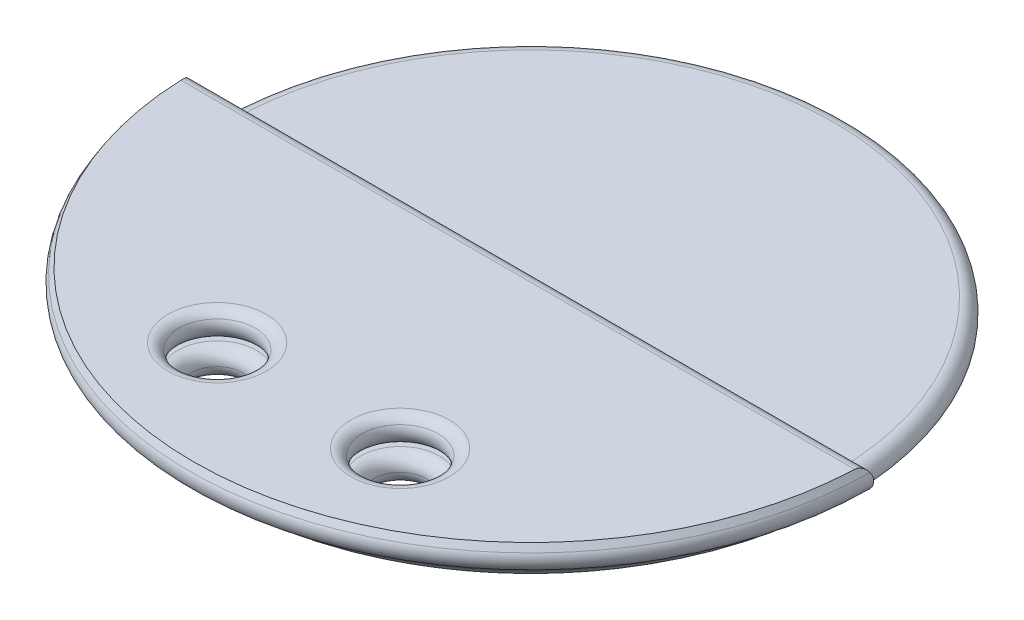
ISO-10303-21;
HEADER;
FILE_DESCRIPTION(('STEP AP214'),'2;1');
FILE_NAME('part.step','',(''),(''),'','','');
FILE_SCHEMA(('AUTOMOTIVE_DESIGN { 1 0 10303 214 1 1 1 1 }'));
ENDSEC;
DATA;
#1=APPLICATION_CONTEXT('core data for automotive mechanical design processes');
#2=APPLICATION_PROTOCOL_DEFINITION('international standard','automotive_design',2000,#1);
#3=PRODUCT_CONTEXT('',#1,'mechanical');
#4=PRODUCT('Part','Part','',(#3));
#5=PRODUCT_RELATED_PRODUCT_CATEGORY('part','',(#4));
#6=PRODUCT_DEFINITION_FORMATION('','',#4);
#7=PRODUCT_DEFINITION_CONTEXT('part definition',#1,'design');
#8=PRODUCT_DEFINITION('design','',#6,#7);
#9=PRODUCT_DEFINITION_SHAPE('','',#8);
#10=(LENGTH_UNIT() NAMED_UNIT(*) SI_UNIT(.MILLI.,.METRE.));
#11=(NAMED_UNIT(*) PLANE_ANGLE_UNIT() SI_UNIT($,.RADIAN.));
#12=(NAMED_UNIT(*) SI_UNIT($,.STERADIAN.) SOLID_ANGLE_UNIT());
#13=UNCERTAINTY_MEASURE_WITH_UNIT(LENGTH_MEASURE(1.E-05),#10,'distance_accuracy_value','');
#14=(GEOMETRIC_REPRESENTATION_CONTEXT(3) GLOBAL_UNCERTAINTY_ASSIGNED_CONTEXT((#13)) GLOBAL_UNIT_ASSIGNED_CONTEXT((#10,
#11,#12)) REPRESENTATION_CONTEXT('',''));
#15=CARTESIAN_POINT('',(0.,0.,0.));
#16=DIRECTION('',(0.,0.,1.));
#17=DIRECTION('',(1.,0.,0.));
#18=AXIS2_PLACEMENT_3D('',#15,#16,#17);
#19=CARTESIAN_POINT('',(0.,0.,0.));
#20=DIRECTION('',(0.,-1.,0.));
#21=DIRECTION('',(0.,0.,1.));
#22=AXIS2_PLACEMENT_3D('',#19,#20,#21);
#23=CONICAL_SURFACE('',#22,27.,0.541052068118243);
#24=CARTESIAN_POINT('',(-25.7788903383954,2.,1.));
#25=CARTESIAN_POINT('',(-25.7798946670546,2.00000153034362,0.974092550447179));
#26=CARTESIAN_POINT('',(-25.7814655599999,1.99899249805883,0.948221567055863));
#27=CARTESIAN_POINT('',(-25.7857146730393,1.99498887810544,0.896735627058436));
#28=CARTESIAN_POINT('',(-25.7883924433159,1.9919950967092,0.871120570773406));
#29=CARTESIAN_POINT('',(-25.7980151743976,1.98013079922269,0.795171663787741));
#30=CARTESIAN_POINT('',(-25.8065608012099,1.96837649097376,0.745455678341163));
#31=CARTESIAN_POINT('',(-25.8275265542735,1.93782110425295,0.649225630342428));
#32=CARTESIAN_POINT('',(-25.8399420440254,1.91902845304707,0.602707817024632));
#33=CARTESIAN_POINT('',(-25.8681796817714,1.87523938674904,0.513774824692059));
#34=CARTESIAN_POINT('',(-25.8840050402291,1.85023712176358,0.471363567006466));
#35=CARTESIAN_POINT('',(-25.9195662451577,1.79334308981068,0.389052058783427));
#36=CARTESIAN_POINT('',(-25.9394788319936,1.76112973399633,0.349451703024237));
#37=CARTESIAN_POINT('',(-25.9819298672412,1.69195173762554,0.276301507714218));
#38=CARTESIAN_POINT('',(-26.0044688341175,1.65498615879986,0.242752866153402));
#39=CARTESIAN_POINT('',(-26.0546332429785,1.57237921659737,0.178129090458688));
#40=CARTESIAN_POINT('',(-26.0825405550834,1.5262329051309,0.14791893114573));
#41=CARTESIAN_POINT('',(-26.1402792574011,1.43054525161788,0.0957850895572815));
#42=CARTESIAN_POINT('',(-26.1701126637978,1.38100034851332,0.0738702607955773));
#43=CARTESIAN_POINT('',(-26.2327777877133,1.27683971054663,0.0374116847880324));
#44=CARTESIAN_POINT('',(-26.2656833594733,1.22209608335717,0.0233621888684094));
#45=CARTESIAN_POINT('',(-26.3321099915318,1.11155525106365,0.00466499210940868));
#46=CARTESIAN_POINT('',(-26.3656295085606,1.05576067975062,-3.69174802402871E-06));
#47=CARTESIAN_POINT('',(-26.3991393809724,1.,0.));
#48=B_SPLINE_CURVE_WITH_KNOTS('',3,(#24,#25,#26,#27,#28,#29,#30,#31,#32,#33,#34,#35,#36,#37,#38,
#39,#40,#41,#42,#43,#44,#45,#46,#47),.UNSPECIFIED.,.F.,.F.,(4,2,2,2,2,2,2,2,2,2,2,4),(0.,
0.0777272711243,0.155422986128972,0.30999007935142,0.464372692325805,0.618901299956091,
0.782631379011794,0.946393834391239,1.13109870484476,1.31600015660756,1.51149525694075,
1.70655258448807),.UNSPECIFIED.);
#49=CARTESIAN_POINT('',(-25.7788903383954,2.,1.));
#50=VERTEX_POINT('',#49);
#51=CARTESIAN_POINT('',(-26.089282299631,1.51503807491007,0.14283269929754));
#52=VERTEX_POINT('',#51);
#53=EDGE_CURVE('E160',#50,#52,#48,.T.);
#54=ORIENTED_EDGE('',*,*,#53,.T.);
#55=CARTESIAN_POINT('',(0.,1.51503807491005,0.));
#56=DIRECTION('',(0.,1.,0.));
#57=DIRECTION('',(0.,0.,1.));
#58=AXIS2_PLACEMENT_3D('',#55,#56,#57);
#59=CIRCLE('',#58,26.0896732844592);
#60=CARTESIAN_POINT('',(26.089282299631,1.51503807491005,0.14283269929691));
#61=VERTEX_POINT('',#60);
#62=EDGE_CURVE('E471',#52,#61,#59,.T.);
#63=ORIENTED_EDGE('',*,*,#62,.T.);
#64=CARTESIAN_POINT('',(26.3991393809724,1.,0.));
#65=CARTESIAN_POINT('',(26.355319059979,1.07290230765303,-2.49248500263294E-05));
#66=CARTESIAN_POINT('',(26.3114516372295,1.14593569094938,0.00797691501654385));
#67=CARTESIAN_POINT('',(26.2250080935554,1.28976784517749,0.0400593295119263));
#68=CARTESIAN_POINT('',(26.182441084357,1.3605509477685,0.0642341897393475));
#69=CARTESIAN_POINT('',(26.1055614828887,1.48812348885111,0.124733949032164));
#70=CARTESIAN_POINT('',(26.0708768600256,1.54556440118513,0.159204675746858));
#71=CARTESIAN_POINT('',(26.0053348292963,1.65360828918933,0.240175153285255));
#72=CARTESIAN_POINT('',(25.9744675756638,1.70422888736515,0.286642961999992));
#73=CARTESIAN_POINT('',(25.9210241866944,1.79102631421343,0.385099199792852));
#74=CARTESIAN_POINT('',(25.8979110329786,1.82817613478794,0.435933593514028));
#75=CARTESIAN_POINT('',(25.8569671028184,1.89285730081605,0.545221985275663));
#76=CARTESIAN_POINT('',(25.8391264714065,1.92040660826285,0.603661470087247));
#77=CARTESIAN_POINT('',(25.8118265103909,1.96094238804071,0.717656512875756));
#78=CARTESIAN_POINT('',(25.8015452874734,1.97542402685186,0.772477585503985));
#79=CARTESIAN_POINT('',(25.790033402827,1.99007954933725,0.856599435606947));
#80=CARTESIAN_POINT('',(25.7868435266118,1.99378733568029,0.885058427902618));
#81=CARTESIAN_POINT('',(25.7818305064388,1.99875000760033,0.942329471889238));
#82=CARTESIAN_POINT('',(25.7800083741546,2.00000307860859,0.97114176893007));
#83=CARTESIAN_POINT('',(25.7788903383954,2.,1.));
#84=B_SPLINE_CURVE_WITH_KNOTS('',3,(#64,#65,#66,#67,#68,#69,#70,#71,#72,#73,#74,#75,#76,#77,#78,
#79,#80,#81,#82,#83),.UNSPECIFIED.,.F.,.F.,(4,2,2,2,2,2,2,2,2,4),(0.,0.255041795921747,
0.51158354549606,0.736656091798944,0.961135455957766,1.16114364780234,1.3607756013745,
1.53256564929295,1.61907057856992,1.70563942971694),.UNSPECIFIED.);
#85=CARTESIAN_POINT('',(25.7788903383954,2.,1.));
#86=VERTEX_POINT('',#85);
#87=EDGE_CURVE('E169',#61,#86,#84,.T.);
#88=ORIENTED_EDGE('',*,*,#87,.T.);
#89=CARTESIAN_POINT('',(0.,2.,0.));
#90=DIRECTION('',(0.,1.,0.));
#91=DIRECTION('',(0.,0.,1.));
#92=AXIS2_PLACEMENT_3D('',#89,#90,#91);
#93=CIRCLE('',#92,25.7982787619449);
#94=EDGE_CURVE('E124',#50,#86,#93,.T.);
#95=ORIENTED_EDGE('',*,*,#94,.F.);
#96=EDGE_LOOP('',(#54,#63,#88,#95));
#97=FACE_BOUND('',#96,.T.);
#98=ADVANCED_FACE('F41',(#97),#23,.T.);
#99=CARTESIAN_POINT('',(0.,2.,0.));
#100=DIRECTION('',(0.,1.,0.));
#101=DIRECTION('',(0.,0.,1.));
#102=AXIS2_PLACEMENT_3D('',#99,#100,#101);
#103=PLANE('',#102);
#104=ORIENTED_EDGE('',*,*,#94,.T.);
#105=DIRECTION('',(1.,0.,0.));
#106=VECTOR('',#105,1.);
#107=CARTESIAN_POINT('',(-25.7982787619449,2.,1.));
#108=LINE('',#107,#106);
#109=EDGE_CURVE('E108',#86,#50,#108,.F.);
#110=ORIENTED_EDGE('',*,*,#109,.T.);
#111=EDGE_LOOP('',(#104,#110));
#112=FACE_BOUND('',#111,.T.);
#113=CARTESIAN_POINT('',(7.,2.,17.));
#114=DIRECTION('',(0.,1.,0.));
#115=DIRECTION('',(0.,0.,1.));
#116=AXIS2_PLACEMENT_3D('',#113,#114,#115);
#117=CIRCLE('',#116,3.76749401624289);
#118=CARTESIAN_POINT('',(7.,2.,20.7674940162429));
#119=VERTEX_POINT('',#118);
#120=EDGE_CURVE('E137',#119,#119,#117,.F.);
#121=ORIENTED_EDGE('',*,*,#120,.T.);
#122=EDGE_LOOP('',(#121));
#123=FACE_BOUND('',#122,.T.);
#124=CARTESIAN_POINT('',(-7.,2.,17.));
#125=DIRECTION('',(0.,1.,0.));
#126=DIRECTION('',(0.,0.,1.));
#127=AXIS2_PLACEMENT_3D('',#124,#125,#126);
#128=CIRCLE('',#127,3.76749401624289);
#129=CARTESIAN_POINT('',(-7.,2.,20.7674940162429));
#130=VERTEX_POINT('',#129);
#131=EDGE_CURVE('E134',#130,#130,#128,.F.);
#132=ORIENTED_EDGE('',*,*,#131,.T.);
#133=EDGE_LOOP('',(#132));
#134=FACE_BOUND('',#133,.T.);
#135=ADVANCED_FACE('F183',(#112,#123,#134),#103,.T.);
#136=CARTESIAN_POINT('',(-7.,1.,17.));
#137=DIRECTION('',(0.,1.,0.));
#138=DIRECTION('',(0.,0.,1.));
#139=AXIS2_PLACEMENT_3D('',#136,#137,#138);
#140=TOROIDAL_SURFACE('',#139,3.76749401624289,1.);
#141=ORIENTED_EDGE('',*,*,#131,.F.);
#142=EDGE_LOOP('',(#141));
#143=FACE_BOUND('',#142,.T.);
#144=CARTESIAN_POINT('',(-7.,1.51503807491006,17.));
#145=DIRECTION('',(0.,-1.,0.));
#146=DIRECTION('',(0.,0.,-1.));
#147=AXIS2_PLACEMENT_3D('',#144,#145,#146);
#148=CIRCLE('',#147,2.91032671554078);
#149=CARTESIAN_POINT('',(-7.,1.51503807491006,14.0896732844592));
#150=VERTEX_POINT('',#149);
#151=EDGE_CURVE('E128',#150,#150,#148,.F.);
#152=ORIENTED_EDGE('',*,*,#151,.F.);
#153=EDGE_LOOP('',(#152));
#154=FACE_BOUND('',#153,.T.);
#155=ADVANCED_FACE('F191',(#143,#154),#140,.T.);
#156=CARTESIAN_POINT('',(-7.,1.,17.));
#157=DIRECTION('',(0.,1.,0.));
#158=DIRECTION('',(0.,0.,1.));
#159=AXIS2_PLACEMENT_3D('',#156,#157,#158);
#160=TOROIDAL_SURFACE('',#159,3.76749401624289,1.);
#161=ORIENTED_EDGE('',*,*,#151,.T.);
#162=EDGE_LOOP('',(#161));
#163=FACE_BOUND('',#162,.T.);
#164=CARTESIAN_POINT('',(-7.,0.,17.));
#165=DIRECTION('',(0.,1.,0.));
#166=DIRECTION('',(0.,0.,1.));
#167=AXIS2_PLACEMENT_3D('',#164,#165,#166);
#168=CIRCLE('',#167,3.76749401624289);
#169=CARTESIAN_POINT('',(-7.,0.,20.7674940162429));
#170=VERTEX_POINT('',#169);
#171=EDGE_CURVE('E131',#170,#170,#168,.T.);
#172=ORIENTED_EDGE('',*,*,#171,.F.);
#173=EDGE_LOOP('',(#172));
#174=FACE_BOUND('',#173,.T.);
#175=ADVANCED_FACE('F186',(#163,#174),#160,.T.);
#176=CARTESIAN_POINT('',(7.,1.,17.));
#177=DIRECTION('',(0.,1.,0.));
#178=DIRECTION('',(0.,0.,1.));
#179=AXIS2_PLACEMENT_3D('',#176,#177,#178);
#180=TOROIDAL_SURFACE('',#179,3.76749401624289,1.);
#181=ORIENTED_EDGE('',*,*,#120,.F.);
#182=EDGE_LOOP('',(#181));
#183=FACE_BOUND('',#182,.T.);
#184=CARTESIAN_POINT('',(7.,1.51503807491005,17.));
#185=DIRECTION('',(0.,-1.,0.));
#186=DIRECTION('',(0.,0.,-1.));
#187=AXIS2_PLACEMENT_3D('',#184,#185,#186);
#188=CIRCLE('',#187,2.91032671554078);
#189=CARTESIAN_POINT('',(7.,1.51503807491005,14.0896732844592));
#190=VERTEX_POINT('',#189);
#191=EDGE_CURVE('E143',#190,#190,#188,.F.);
#192=ORIENTED_EDGE('',*,*,#191,.F.);
#193=EDGE_LOOP('',(#192));
#194=FACE_BOUND('',#193,.T.);
#195=ADVANCED_FACE('F190',(#183,#194),#180,.T.);
#196=CARTESIAN_POINT('',(7.,1.,17.));
#197=DIRECTION('',(0.,1.,0.));
#198=DIRECTION('',(0.,0.,1.));
#199=AXIS2_PLACEMENT_3D('',#196,#197,#198);
#200=TOROIDAL_SURFACE('',#199,3.76749401624289,1.);
#201=ORIENTED_EDGE('',*,*,#191,.T.);
#202=EDGE_LOOP('',(#201));
#203=FACE_BOUND('',#202,.T.);
#204=CARTESIAN_POINT('',(7.,0.,17.));
#205=DIRECTION('',(0.,1.,0.));
#206=DIRECTION('',(0.,0.,1.));
#207=AXIS2_PLACEMENT_3D('',#204,#205,#206);
#208=CIRCLE('',#207,3.76749401624289);
#209=CARTESIAN_POINT('',(7.,0.,20.7674940162429));
#210=VERTEX_POINT('',#209);
#211=EDGE_CURVE('E127',#210,#210,#208,.T.);
#212=ORIENTED_EDGE('',*,*,#211,.F.);
#213=EDGE_LOOP('',(#212));
#214=FACE_BOUND('',#213,.T.);
#215=ADVANCED_FACE('F196',(#203,#214),#200,.T.);
#216=CARTESIAN_POINT('',(0.,0.,0.));
#217=DIRECTION('',(0.,1.,0.));
#218=DIRECTION('',(0.,0.,1.));
#219=AXIS2_PLACEMENT_3D('',#216,#217,#218);
#220=PLANE('',#219);
#221=CARTESIAN_POINT('',(7.,0.,17.));
#222=DIRECTION('',(0.,1.,0.));
#223=DIRECTION('',(0.,0.,1.));
#224=AXIS2_PLACEMENT_3D('',#221,#222,#223);
#225=CIRCLE('',#224,3.);
#226=CARTESIAN_POINT('',(7.,0.,20.));
#227=VERTEX_POINT('',#226);
#228=EDGE_CURVE('E140',#227,#227,#225,.F.);
#229=ORIENTED_EDGE('',*,*,#228,.T.);
#230=EDGE_LOOP('',(#229));
#231=FACE_BOUND('',#230,.T.);
#232=ORIENTED_EDGE('',*,*,#211,.T.);
#233=EDGE_LOOP('',(#232));
#234=FACE_BOUND('',#233,.T.);
#235=ADVANCED_FACE('F199',(#231,#234),#220,.T.);
#236=CARTESIAN_POINT('',(-7.,0.,17.));
#237=DIRECTION('',(0.,1.,0.));
#238=DIRECTION('',(0.,0.,1.));
#239=AXIS2_PLACEMENT_3D('',#236,#237,#238);
#240=CIRCLE('',#239,3.);
#241=CARTESIAN_POINT('',(-7.,0.,20.));
#242=VERTEX_POINT('',#241);
#243=EDGE_CURVE('E115',#242,#242,#240,.F.);
#244=ORIENTED_EDGE('',*,*,#243,.T.);
#245=EDGE_LOOP('',(#244));
#246=FACE_BOUND('',#245,.T.);
#247=ORIENTED_EDGE('',*,*,#171,.T.);
#248=EDGE_LOOP('',(#247));
#249=FACE_BOUND('',#248,.T.);
#250=ADVANCED_FACE('F234',(#246,#249),#220,.T.);
#251=CARTESIAN_POINT('',(0.,-2.,0.));
#252=DIRECTION('',(0.,1.,0.));
#253=DIRECTION('',(0.,0.,1.));
#254=AXIS2_PLACEMENT_3D('',#251,#252,#253);
#255=PLANE('',#254);
#256=CARTESIAN_POINT('',(0.,-2.,0.));
#257=DIRECTION('',(0.,1.,0.));
#258=DIRECTION('',(0.,0.,1.));
#259=AXIS2_PLACEMENT_3D('',#256,#257,#258);
#260=CIRCLE('',#259,22.087334141823);
#261=CARTESIAN_POINT('',(0.,-2.,22.087334141823));
#262=VERTEX_POINT('',#261);
#263=EDGE_CURVE('E465',#262,#262,#260,.F.);
#264=ORIENTED_EDGE('',*,*,#263,.T.);
#265=EDGE_LOOP('',(#264));
#266=FACE_BOUND('',#265,.T.);
#267=CARTESIAN_POINT('',(7.,-2.,17.));
#268=DIRECTION('',(0.,1.,0.));
#269=DIRECTION('',(0.,0.,1.));
#270=AXIS2_PLACEMENT_3D('',#267,#268,#269);
#271=CIRCLE('',#270,3.);
#272=CARTESIAN_POINT('',(7.,-2.,20.));
#273=VERTEX_POINT('',#272);
#274=EDGE_CURVE('E151',#273,#273,#271,.T.);
#275=ORIENTED_EDGE('',*,*,#274,.T.);
#276=EDGE_LOOP('',(#275));
#277=FACE_BOUND('',#276,.T.);
#278=CARTESIAN_POINT('',(-7.,-2.,17.));
#279=DIRECTION('',(0.,1.,0.));
#280=DIRECTION('',(0.,0.,1.));
#281=AXIS2_PLACEMENT_3D('',#278,#279,#280);
#282=CIRCLE('',#281,3.);
#283=CARTESIAN_POINT('',(-7.,-2.,20.));
#284=VERTEX_POINT('',#283);
#285=EDGE_CURVE('E148',#284,#284,#282,.T.);
#286=ORIENTED_EDGE('',*,*,#285,.T.);
#287=EDGE_LOOP('',(#286));
#288=FACE_BOUND('',#287,.T.);
#289=ADVANCED_FACE('F212',(#266,#277,#288),#255,.F.);
#290=CARTESIAN_POINT('',(7.,-1.,17.));
#291=DIRECTION('',(0.,1.,0.));
#292=DIRECTION('',(0.,0.,1.));
#293=AXIS2_PLACEMENT_3D('',#290,#291,#292);
#294=TOROIDAL_SURFACE('',#293,3.,1.);
#295=ORIENTED_EDGE('',*,*,#274,.F.);
#296=EDGE_LOOP('',(#295));
#297=FACE_BOUND('',#296,.T.);
#298=CARTESIAN_POINT('',(7.,-1.,17.));
#299=DIRECTION('',(0.,1.,0.));
#300=DIRECTION('',(0.,0.,1.));
#301=AXIS2_PLACEMENT_3D('',#298,#299,#300);
#302=CIRCLE('',#301,2.);
#303=CARTESIAN_POINT('',(7.,-1.,19.));
#304=VERTEX_POINT('',#303);
#305=EDGE_CURVE('E121',#304,#304,#302,.F.);
#306=ORIENTED_EDGE('',*,*,#305,.F.);
#307=EDGE_LOOP('',(#306));
#308=FACE_BOUND('',#307,.T.);
#309=ADVANCED_FACE('F208',(#297,#308),#294,.T.);
#310=CARTESIAN_POINT('',(7.,-1.,17.));
#311=DIRECTION('',(0.,1.,0.));
#312=DIRECTION('',(0.,0.,1.));
#313=AXIS2_PLACEMENT_3D('',#310,#311,#312);
#314=TOROIDAL_SURFACE('',#313,3.,1.);
#315=ORIENTED_EDGE('',*,*,#228,.F.);
#316=EDGE_LOOP('',(#315));
#317=FACE_BOUND('',#316,.T.);
#318=ORIENTED_EDGE('',*,*,#305,.T.);
#319=EDGE_LOOP('',(#318));
#320=FACE_BOUND('',#319,.T.);
#321=ADVANCED_FACE('F204',(#317,#320),#314,.T.);
#322=CARTESIAN_POINT('',(-7.,-1.,17.));
#323=DIRECTION('',(0.,1.,0.));
#324=DIRECTION('',(0.,0.,1.));
#325=AXIS2_PLACEMENT_3D('',#322,#323,#324);
#326=TOROIDAL_SURFACE('',#325,3.,1.);
#327=ORIENTED_EDGE('',*,*,#243,.F.);
#328=EDGE_LOOP('',(#327));
#329=FACE_BOUND('',#328,.T.);
#330=CARTESIAN_POINT('',(-7.,-1.,17.));
#331=DIRECTION('',(0.,1.,0.));
#332=DIRECTION('',(0.,0.,1.));
#333=AXIS2_PLACEMENT_3D('',#330,#331,#332);
#334=CIRCLE('',#333,2.);
#335=CARTESIAN_POINT('',(-7.,-1.,19.));
#336=VERTEX_POINT('',#335);
#337=EDGE_CURVE('E118',#336,#336,#334,.T.);
#338=ORIENTED_EDGE('',*,*,#337,.F.);
#339=EDGE_LOOP('',(#338));
#340=FACE_BOUND('',#339,.T.);
#341=ADVANCED_FACE('F207',(#329,#340),#326,.T.);
#342=CARTESIAN_POINT('',(-7.,-1.,17.));
#343=DIRECTION('',(0.,1.,0.));
#344=DIRECTION('',(0.,0.,1.));
#345=AXIS2_PLACEMENT_3D('',#342,#343,#344);
#346=TOROIDAL_SURFACE('',#345,3.,1.);
#347=ORIENTED_EDGE('',*,*,#337,.T.);
#348=EDGE_LOOP('',(#347));
#349=FACE_BOUND('',#348,.T.);
#350=ORIENTED_EDGE('',*,*,#285,.F.);
#351=EDGE_LOOP('',(#350));
#352=FACE_BOUND('',#351,.T.);
#353=ADVANCED_FACE('F214',(#349,#352),#346,.T.);
#354=CARTESIAN_POINT('',(0.,0.,0.));
#355=DIRECTION('',(0.,0.,1.));
#356=DIRECTION('',(1.,0.,0.));
#357=AXIS2_PLACEMENT_3D('',#354,#355,#356);
#358=PLANE('',#357);
#359=CARTESIAN_POINT('',(25.2325059837571,1.,0.));
#360=DIRECTION('',(0.,0.,1.));
#361=DIRECTION('',(1.,0.,0.));
#362=AXIS2_PLACEMENT_3D('',#359,#360,#361);
#363=CIRCLE('',#362,1.);
#364=CARTESIAN_POINT('',(26.2325059837571,1.,0.));
#365=VERTEX_POINT('',#364);
#366=CARTESIAN_POINT('',(25.6342286317033,0.0842386150709838,0.));
#367=VERTEX_POINT('',#366);
#368=EDGE_CURVE('E450',#365,#367,#363,.F.);
#369=ORIENTED_EDGE('',*,*,#368,.T.);
#370=CARTESIAN_POINT('',(26.8393965755419,-2.66304553971626,0.));
#371=DIRECTION('',(0.,0.,1.));
#372=DIRECTION('',(1.,0.,0.));
#373=AXIS2_PLACEMENT_3D('',#370,#371,#372);
#374=CIRCLE('',#373,3.);
#375=CARTESIAN_POINT('',(24.4633653586826,-0.831522769858207,0.));
#376=VERTEX_POINT('',#375);
#377=EDGE_CURVE('E49',#367,#376,#374,.T.);
#378=ORIENTED_EDGE('',*,*,#377,.T.);
#379=CARTESIAN_POINT('',(22.087334141823,1.,0.));
#380=DIRECTION('',(0.,0.,1.));
#381=DIRECTION('',(1.,0.,0.));
#382=AXIS2_PLACEMENT_3D('',#379,#380,#381);
#383=CIRCLE('',#382,3.);
#384=CARTESIAN_POINT('',(24.1854967259669,-1.14422801271202,0.));
#385=VERTEX_POINT('',#384);
#386=EDGE_CURVE('E462',#376,#385,#383,.F.);
#387=ORIENTED_EDGE('',*,*,#386,.T.);
#388=CARTESIAN_POINT('',(23.1959522447286,-1.,0.));
#389=DIRECTION('',(0.,0.,1.));
#390=DIRECTION('',(1.,0.,0.));
#391=AXIS2_PLACEMENT_3D('',#388,#389,#390);
#392=CIRCLE('',#391,1.);
#393=CARTESIAN_POINT('',(23.1959522447286,0.,0.));
#394=VERTEX_POINT('',#393);
#395=EDGE_CURVE('E107',#385,#394,#392,.T.);
#396=ORIENTED_EDGE('',*,*,#395,.T.);
#397=DIRECTION('',(1.,0.,0.));
#398=VECTOR('',#397,1.);
#399=CARTESIAN_POINT('',(0.,0.,0.));
#400=LINE('',#399,#398);
#401=CARTESIAN_POINT('',(-23.1959522447286,0.,0.));
#402=VERTEX_POINT('',#401);
#403=EDGE_CURVE('E113',#402,#394,#400,.T.);
#404=ORIENTED_EDGE('',*,*,#403,.F.);
#405=CARTESIAN_POINT('',(-23.1959522447286,-1.,0.));
#406=DIRECTION('',(0.,0.,1.));
#407=DIRECTION('',(1.,0.,0.));
#408=AXIS2_PLACEMENT_3D('',#405,#406,#407);
#409=CIRCLE('',#408,1.);
#410=CARTESIAN_POINT('',(-24.1854967259669,-1.14422801271202,0.));
#411=VERTEX_POINT('',#410);
#412=EDGE_CURVE('E99',#402,#411,#409,.T.);
#413=ORIENTED_EDGE('',*,*,#412,.T.);
#414=CARTESIAN_POINT('',(-22.087334141823,1.,0.));
#415=DIRECTION('',(0.,0.,1.));
#416=DIRECTION('',(1.,0.,0.));
#417=AXIS2_PLACEMENT_3D('',#414,#415,#416);
#418=CIRCLE('',#417,3.);
#419=CARTESIAN_POINT('',(-24.4633653586826,-0.831522769858191,0.));
#420=VERTEX_POINT('',#419);
#421=EDGE_CURVE('E445',#411,#420,#418,.F.);
#422=ORIENTED_EDGE('',*,*,#421,.T.);
#423=CARTESIAN_POINT('',(-26.8393965755419,-2.66304553971626,0.));
#424=DIRECTION('',(0.,0.,1.));
#425=DIRECTION('',(1.,0.,0.));
#426=AXIS2_PLACEMENT_3D('',#423,#424,#425);
#427=CIRCLE('',#426,3.);
#428=CARTESIAN_POINT('',(-25.6342286317033,0.0842386150709838,0.));
#429=VERTEX_POINT('',#428);
#430=EDGE_CURVE('E11',#420,#429,#427,.T.);
#431=ORIENTED_EDGE('',*,*,#430,.T.);
#432=CARTESIAN_POINT('',(-25.2325059837571,1.,0.));
#433=DIRECTION('',(0.,0.,1.));
#434=DIRECTION('',(1.,0.,0.));
#435=AXIS2_PLACEMENT_3D('',#432,#433,#434);
#436=CIRCLE('',#435,1.);
#437=CARTESIAN_POINT('',(-26.2325059837588,1.,0.));
#438=VERTEX_POINT('',#437);
#439=EDGE_CURVE('E443',#429,#438,#436,.F.);
#440=ORIENTED_EDGE('',*,*,#439,.T.);
#441=DIRECTION('',(1.,0.,0.));
#442=VECTOR('',#441,1.);
#443=CARTESIAN_POINT('',(25.7982787619449,1.,0.));
#444=LINE('',#443,#442);
#445=EDGE_CURVE('E114',#438,#365,#444,.T.);
#446=ORIENTED_EDGE('',*,*,#445,.T.);
#447=EDGE_LOOP('',(#369,#378,#387,#396,#404,#413,#422,#431,#440,#446));
#448=FACE_BOUND('',#447,.T.);
#449=ADVANCED_FACE('F117',(#448),#358,.F.);
#450=CARTESIAN_POINT('',(0.,0.,0.));
#451=DIRECTION('',(0.,1.,0.));
#452=DIRECTION('',(0.,0.,1.));
#453=AXIS2_PLACEMENT_3D('',#450,#451,#452);
#454=PLANE('',#453);
#455=ORIENTED_EDGE('',*,*,#403,.T.);
#456=CARTESIAN_POINT('',(0.,0.,0.));
#457=DIRECTION('',(0.,1.,0.));
#458=DIRECTION('',(0.,0.,1.));
#459=AXIS2_PLACEMENT_3D('',#456,#457,#458);
#460=CIRCLE('',#459,23.1959522447286);
#461=EDGE_CURVE('E103',#394,#402,#460,.T.);
#462=ORIENTED_EDGE('',*,*,#461,.T.);
#463=EDGE_LOOP('',(#455,#462));
#464=FACE_BOUND('',#463,.T.);
#465=ADVANCED_FACE('F112',(#464),#454,.T.);
#466=CARTESIAN_POINT('',(0.,-1.,0.));
#467=DIRECTION('',(0.,1.,0.));
#468=DIRECTION('',(0.,0.,1.));
#469=AXIS2_PLACEMENT_3D('',#466,#467,#468);
#470=TOROIDAL_SURFACE('',#469,23.1959522447286,1.);
#471=ORIENTED_EDGE('',*,*,#395,.F.);
#472=CARTESIAN_POINT('',(0.,-1.14422801271202,0.));
#473=DIRECTION('',(0.,1.,0.));
#474=DIRECTION('',(0.,0.,1.));
#475=AXIS2_PLACEMENT_3D('',#472,#473,#474);
#476=CIRCLE('',#475,24.1854967259669);
#477=EDGE_CURVE('E105',#385,#411,#476,.T.);
#478=ORIENTED_EDGE('',*,*,#477,.T.);
#479=ORIENTED_EDGE('',*,*,#412,.F.);
#480=ORIENTED_EDGE('',*,*,#461,.F.);
#481=EDGE_LOOP('',(#471,#478,#479,#480));
#482=FACE_BOUND('',#481,.T.);
#483=ADVANCED_FACE('F102',(#482),#470,.T.);
#484=CARTESIAN_POINT('',(0.,1.,1.));
#485=DIRECTION('',(-1.,0.,0.));
#486=DIRECTION('',(0.,0.,1.));
#487=AXIS2_PLACEMENT_3D('',#484,#485,#486);
#488=CYLINDRICAL_SURFACE('',#487,1.);
#489=ORIENTED_EDGE('',*,*,#87,.F.);
#490=CARTESIAN_POINT('',(26.089282299631,1.51503807491005,0.14283269929691));
#491=CARTESIAN_POINT('',(26.1103494602537,1.48021029176867,0.121880788316921));
#492=CARTESIAN_POINT('',(26.129729718361,1.44322771947368,0.102580631807027));
#493=CARTESIAN_POINT('',(26.1636901901752,1.36664893453848,0.0687308262823203));
#494=CARTESIAN_POINT('',(26.1783945142917,1.32716119020836,0.054058450830753));
#495=CARTESIAN_POINT('',(26.2039381774893,1.24173489783127,0.0285556941928335));
#496=CARTESIAN_POINT('',(26.2143523504035,1.19553302423537,0.0181483370588416));
#497=CARTESIAN_POINT('',(26.2250931639539,1.12401621018989,0.00741201253316403));
#498=CARTESIAN_POINT('',(26.2278625757964,1.0993960504257,0.00464310024811581));
#499=CARTESIAN_POINT('',(26.2315721671807,1.04985747202494,0.000933827899817652));
#500=CARTESIAN_POINT('',(26.2325105030258,1.0249387781634,-4.6891515650481E-06));
#501=CARTESIAN_POINT('',(26.2325059837571,0.999999999999496,0.));
#502=B_SPLINE_CURVE_WITH_KNOTS('',3,(#490,#491,#492,#493,#494,#495,#496,#497,#498,#499,#500,
#501),.UNSPECIFIED.,.F.,.F.,(4,2,2,2,2,4),(0.,0.137378527878908,0.270727857802879,
0.415210120238376,0.489878372016765,0.564621767987691),.UNSPECIFIED.);
#503=EDGE_CURVE('E451',#61,#365,#502,.T.);
#504=ORIENTED_EDGE('',*,*,#503,.T.);
#505=ORIENTED_EDGE('',*,*,#445,.F.);
#506=CARTESIAN_POINT('',(-26.2325059837588,1.,0.));
#507=CARTESIAN_POINT('',(-26.2325093364236,1.0227755847773,-3.47005355706951E-06));
#508=CARTESIAN_POINT('',(-26.2317273296343,1.04553652228824,0.000778662764150706));
#509=CARTESIAN_POINT('',(-26.2286299445077,1.09083167598458,0.00387582414998497));
#510=CARTESIAN_POINT('',(-26.2263157462944,1.11336605312105,0.00618967296012003));
#511=CARTESIAN_POINT('',(-26.2173133713344,1.17904098707735,0.0151889105062671));
#512=CARTESIAN_POINT('',(-26.2085584855973,1.2216448116337,0.0239390250706138));
#513=CARTESIAN_POINT('',(-26.1849606852432,1.30815766940495,0.0475050678374023));
#514=CARTESIAN_POINT('',(-26.1695999149144,1.35177680403649,0.0628366945751601));
#515=CARTESIAN_POINT('',(-26.1333709016456,1.43625298237866,0.0989542231284464));
#516=CARTESIAN_POINT('',(-26.1123360176618,1.47696933110406,0.119905023676322));
#517=CARTESIAN_POINT('',(-26.089282299631,1.51503807490998,0.142832699297844));
#518=B_SPLINE_CURVE_WITH_KNOTS('',3,(#506,#507,#508,#509,#510,#511,#512,#513,#514,#515,#516,
#517),.UNSPECIFIED.,.F.,.F.,(4,2,2,2,2,4),(0.,0.0682722348871521,0.13649194623478,
0.268823025140802,0.414283686743878,0.564597130161984),.UNSPECIFIED.);
#519=EDGE_CURVE('E449',#438,#52,#518,.T.);
#520=ORIENTED_EDGE('',*,*,#519,.T.);
#521=ORIENTED_EDGE('',*,*,#53,.F.);
#522=ORIENTED_EDGE('',*,*,#109,.F.);
#523=EDGE_LOOP('',(#489,#504,#505,#520,#521,#522));
#524=FACE_BOUND('',#523,.T.);
#525=ADVANCED_FACE('F175',(#524),#488,.T.);
#526=CARTESIAN_POINT('',(0.,1.,0.));
#527=DIRECTION('',(0.,1.,0.));
#528=DIRECTION('',(0.,0.,1.));
#529=AXIS2_PLACEMENT_3D('',#526,#527,#528);
#530=TOROIDAL_SURFACE('',#529,25.2325059837571,1.);
#531=ORIENTED_EDGE('',*,*,#439,.F.);
#532=CARTESIAN_POINT('',(0.,0.0842386150707805,0.));
#533=DIRECTION('',(0.,1.,0.));
#534=DIRECTION('',(0.,0.,1.));
#535=AXIS2_PLACEMENT_3D('',#532,#533,#534);
#536=CIRCLE('',#535,25.6342286317034);
#537=EDGE_CURVE('E441',#429,#367,#536,.T.);
#538=ORIENTED_EDGE('',*,*,#537,.T.);
#539=ORIENTED_EDGE('',*,*,#368,.F.);
#540=ORIENTED_EDGE('',*,*,#503,.F.);
#541=ORIENTED_EDGE('',*,*,#62,.F.);
#542=ORIENTED_EDGE('',*,*,#519,.F.);
#543=EDGE_LOOP('',(#531,#538,#539,#540,#541,#542));
#544=FACE_BOUND('',#543,.T.);
#545=ADVANCED_FACE('F225',(#544),#530,.T.);
#546=CARTESIAN_POINT('',(0.,1.,0.));
#547=DIRECTION('',(0.,1.,0.));
#548=DIRECTION('',(0.,0.,1.));
#549=AXIS2_PLACEMENT_3D('',#546,#547,#548);
#550=TOROIDAL_SURFACE('',#549,22.087334141823,3.);
#551=ORIENTED_EDGE('',*,*,#263,.F.);
#552=EDGE_LOOP('',(#551));
#553=FACE_BOUND('',#552,.T.);
#554=ORIENTED_EDGE('',*,*,#386,.F.);
#555=CARTESIAN_POINT('',(0.,-0.831522769858207,0.));
#556=DIRECTION('',(0.,1.,0.));
#557=DIRECTION('',(0.,0.,1.));
#558=AXIS2_PLACEMENT_3D('',#555,#556,#557);
#559=CIRCLE('',#558,24.4633653586826);
#560=EDGE_CURVE('E56',#376,#420,#559,.F.);
#561=ORIENTED_EDGE('',*,*,#560,.T.);
#562=ORIENTED_EDGE('',*,*,#421,.F.);
#563=ORIENTED_EDGE('',*,*,#477,.F.);
#564=EDGE_LOOP('',(#554,#561,#562,#563));
#565=FACE_BOUND('',#564,.T.);
#566=ADVANCED_FACE('F326',(#553,#565),#550,.T.);
#567=CARTESIAN_POINT('',(0.,-2.66304553971626,0.));
#568=DIRECTION('',(0.,1.,0.));
#569=DIRECTION('',(0.,0.,1.));
#570=AXIS2_PLACEMENT_3D('',#567,#568,#569);
#571=TOROIDAL_SURFACE('',#570,26.8393965755419,3.);
#572=ORIENTED_EDGE('',*,*,#430,.F.);
#573=ORIENTED_EDGE('',*,*,#560,.F.);
#574=ORIENTED_EDGE('',*,*,#377,.F.);
#575=ORIENTED_EDGE('',*,*,#537,.F.);
#576=EDGE_LOOP('',(#572,#573,#574,#575));
#577=FACE_BOUND('',#576,.T.);
#578=ADVANCED_FACE('F43',(#577),#571,.F.);
#579=CLOSED_SHELL('',(#98,#135,#155,#175,#195,#215,#235,#250,#289,#309,#321,#341,#353,#449,#465,
#483,#525,#545,#566,#578));
#580=MANIFOLD_SOLID_BREP('B2',#579);
#581=ADVANCED_BREP_SHAPE_REPRESENTATION('',(#18,#580),#14);
#582=SHAPE_DEFINITION_REPRESENTATION(#9,#581);
ENDSEC;
END-ISO-10303-21;
